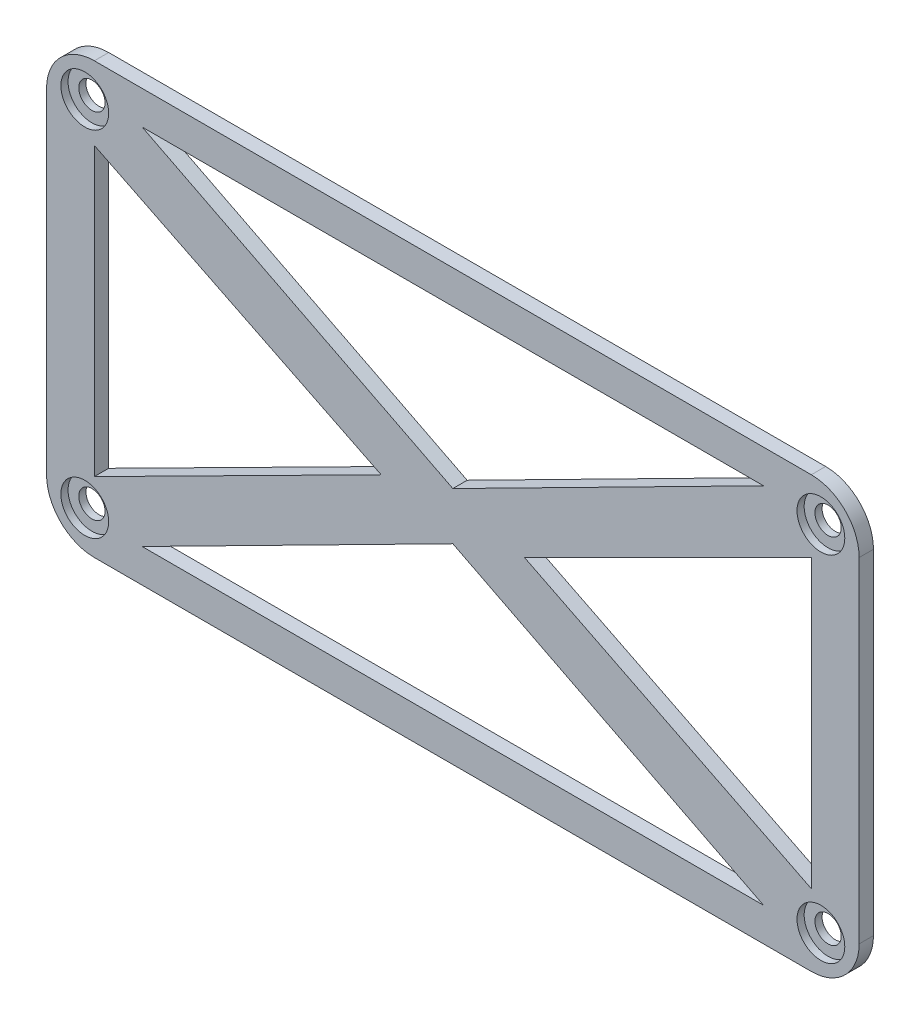
ISO-10303-21;
HEADER;
FILE_DESCRIPTION(('STEP AP214'),'2;1');
FILE_NAME('part.step','',(''),(''),'','','');
FILE_SCHEMA(('AUTOMOTIVE_DESIGN { 1 0 10303 214 1 1 1 1 }'));
ENDSEC;
DATA;
#1=APPLICATION_CONTEXT('core data for automotive mechanical design processes');
#2=APPLICATION_PROTOCOL_DEFINITION('international standard','automotive_design',2000,#1);
#3=PRODUCT_CONTEXT('',#1,'mechanical');
#4=PRODUCT('Part','Part','',(#3));
#5=PRODUCT_RELATED_PRODUCT_CATEGORY('part','',(#4));
#6=PRODUCT_DEFINITION_FORMATION('','',#4);
#7=PRODUCT_DEFINITION_CONTEXT('part definition',#1,'design');
#8=PRODUCT_DEFINITION('design','',#6,#7);
#9=PRODUCT_DEFINITION_SHAPE('','',#8);
#10=(LENGTH_UNIT() NAMED_UNIT(*) SI_UNIT(.MILLI.,.METRE.));
#11=(NAMED_UNIT(*) PLANE_ANGLE_UNIT() SI_UNIT($,.RADIAN.));
#12=(NAMED_UNIT(*) SI_UNIT($,.STERADIAN.) SOLID_ANGLE_UNIT());
#13=UNCERTAINTY_MEASURE_WITH_UNIT(LENGTH_MEASURE(1.E-05),#10,'distance_accuracy_value','');
#14=(GEOMETRIC_REPRESENTATION_CONTEXT(3) GLOBAL_UNCERTAINTY_ASSIGNED_CONTEXT((#13)) GLOBAL_UNIT_ASSIGNED_CONTEXT((#10,
#11,#12)) REPRESENTATION_CONTEXT('',''));
#15=CARTESIAN_POINT('',(0.,0.,0.));
#16=DIRECTION('',(0.,0.,1.));
#17=DIRECTION('',(1.,0.,0.));
#18=AXIS2_PLACEMENT_3D('',#15,#16,#17);
#19=CARTESIAN_POINT('',(-74.5741165309511,37.4873903075342,42.));
#20=DIRECTION('',(0.,0.,-1.));
#21=DIRECTION('',(-1.,0.,0.));
#22=AXIS2_PLACEMENT_3D('',#19,#20,#21);
#23=CYLINDRICAL_SURFACE('',#22,2.75000000000001);
#24=CARTESIAN_POINT('',(-74.5741165309511,37.4873903075342,0.));
#25=DIRECTION('',(0.,0.,1.));
#26=DIRECTION('',(1.,0.,0.));
#27=AXIS2_PLACEMENT_3D('',#24,#25,#26);
#28=CIRCLE('',#27,2.75000000000001);
#29=CARTESIAN_POINT('',(-71.8241165309511,37.4873903075342,0.));
#30=VERTEX_POINT('',#29);
#31=EDGE_CURVE('E306',#30,#30,#28,.F.);
#32=ORIENTED_EDGE('',*,*,#31,.T.);
#33=EDGE_LOOP('',(#32));
#34=FACE_BOUND('',#33,.T.);
#35=CARTESIAN_POINT('',(-74.5741165309511,37.4873903075342,1.5));
#36=DIRECTION('',(0.,0.,1.));
#37=DIRECTION('',(1.,0.,0.));
#38=AXIS2_PLACEMENT_3D('',#35,#36,#37);
#39=CIRCLE('',#38,2.75000000000001);
#40=CARTESIAN_POINT('',(-71.8241165309511,37.4873903075342,1.5));
#41=VERTEX_POINT('',#40);
#42=EDGE_CURVE('E43',#41,#41,#39,.T.);
#43=ORIENTED_EDGE('',*,*,#42,.T.);
#44=EDGE_LOOP('',(#43));
#45=FACE_BOUND('',#44,.T.);
#46=ADVANCED_FACE('F39',(#34,#45),#23,.F.);
#47=CARTESIAN_POINT('',(-74.5741165309511,-36.5126096924658,42.));
#48=DIRECTION('',(0.,0.,-1.));
#49=DIRECTION('',(-1.,0.,0.));
#50=AXIS2_PLACEMENT_3D('',#47,#48,#49);
#51=CYLINDRICAL_SURFACE('',#50,2.75000000000001);
#52=CARTESIAN_POINT('',(-74.5741165309511,-36.5126096924658,0.));
#53=DIRECTION('',(0.,0.,1.));
#54=DIRECTION('',(1.,0.,0.));
#55=AXIS2_PLACEMENT_3D('',#52,#53,#54);
#56=CIRCLE('',#55,2.75000000000001);
#57=CARTESIAN_POINT('',(-71.8241165309511,-36.5126096924658,0.));
#58=VERTEX_POINT('',#57);
#59=EDGE_CURVE('E233',#58,#58,#56,.F.);
#60=ORIENTED_EDGE('',*,*,#59,.T.);
#61=EDGE_LOOP('',(#60));
#62=FACE_BOUND('',#61,.T.);
#63=CARTESIAN_POINT('',(-74.5741165309511,-36.5126096924658,1.5));
#64=DIRECTION('',(0.,0.,1.));
#65=DIRECTION('',(1.,0.,0.));
#66=AXIS2_PLACEMENT_3D('',#63,#64,#65);
#67=CIRCLE('',#66,2.75000000000001);
#68=CARTESIAN_POINT('',(-71.8241165309511,-36.5126096924658,1.5));
#69=VERTEX_POINT('',#68);
#70=EDGE_CURVE('E259',#69,#69,#67,.T.);
#71=ORIENTED_EDGE('',*,*,#70,.T.);
#72=EDGE_LOOP('',(#71));
#73=FACE_BOUND('',#72,.T.);
#74=ADVANCED_FACE('F489',(#62,#73),#51,.F.);
#75=CARTESIAN_POINT('',(79.4258834690489,37.4873903075342,42.));
#76=DIRECTION('',(0.,0.,-1.));
#77=DIRECTION('',(-1.,0.,0.));
#78=AXIS2_PLACEMENT_3D('',#75,#76,#77);
#79=CYLINDRICAL_SURFACE('',#78,2.75000000000001);
#80=CARTESIAN_POINT('',(79.4258834690489,37.4873903075342,0.));
#81=DIRECTION('',(0.,0.,1.));
#82=DIRECTION('',(1.,0.,0.));
#83=AXIS2_PLACEMENT_3D('',#80,#81,#82);
#84=CIRCLE('',#83,2.75000000000001);
#85=CARTESIAN_POINT('',(82.1758834690489,37.4873903075342,0.));
#86=VERTEX_POINT('',#85);
#87=EDGE_CURVE('E237',#86,#86,#84,.F.);
#88=ORIENTED_EDGE('',*,*,#87,.T.);
#89=EDGE_LOOP('',(#88));
#90=FACE_BOUND('',#89,.T.);
#91=CARTESIAN_POINT('',(79.4258834690489,37.4873903075342,1.5));
#92=DIRECTION('',(0.,0.,1.));
#93=DIRECTION('',(1.,0.,0.));
#94=AXIS2_PLACEMENT_3D('',#91,#92,#93);
#95=CIRCLE('',#94,2.75000000000001);
#96=CARTESIAN_POINT('',(82.1758834690489,37.4873903075342,1.5));
#97=VERTEX_POINT('',#96);
#98=EDGE_CURVE('E255',#97,#97,#95,.T.);
#99=ORIENTED_EDGE('',*,*,#98,.T.);
#100=EDGE_LOOP('',(#99));
#101=FACE_BOUND('',#100,.T.);
#102=ADVANCED_FACE('F493',(#90,#101),#79,.F.);
#103=CARTESIAN_POINT('',(79.4258834690489,-36.5126096924658,42.));
#104=DIRECTION('',(0.,0.,-1.));
#105=DIRECTION('',(-1.,0.,0.));
#106=AXIS2_PLACEMENT_3D('',#103,#104,#105);
#107=CYLINDRICAL_SURFACE('',#106,2.75000000000001);
#108=CARTESIAN_POINT('',(79.4258834690489,-36.5126096924658,0.));
#109=DIRECTION('',(0.,0.,1.));
#110=DIRECTION('',(1.,0.,0.));
#111=AXIS2_PLACEMENT_3D('',#108,#109,#110);
#112=CIRCLE('',#111,2.75000000000001);
#113=CARTESIAN_POINT('',(82.1758834690489,-36.5126096924658,0.));
#114=VERTEX_POINT('',#113);
#115=EDGE_CURVE('E242',#114,#114,#112,.F.);
#116=ORIENTED_EDGE('',*,*,#115,.T.);
#117=EDGE_LOOP('',(#116));
#118=FACE_BOUND('',#117,.T.);
#119=CARTESIAN_POINT('',(79.4258834690489,-36.5126096924658,1.5));
#120=DIRECTION('',(0.,0.,1.));
#121=DIRECTION('',(1.,0.,0.));
#122=AXIS2_PLACEMENT_3D('',#119,#120,#121);
#123=CIRCLE('',#122,2.75000000000001);
#124=CARTESIAN_POINT('',(82.1758834690489,-36.5126096924658,1.5));
#125=VERTEX_POINT('',#124);
#126=EDGE_CURVE('E251',#125,#125,#123,.T.);
#127=ORIENTED_EDGE('',*,*,#126,.T.);
#128=EDGE_LOOP('',(#127));
#129=FACE_BOUND('',#128,.T.);
#130=ADVANCED_FACE('F498',(#118,#129),#107,.F.);
#131=CARTESIAN_POINT('',(-72.5741165309511,35.4873903075342,3.));
#132=DIRECTION('',(0.,0.,-1.));
#133=DIRECTION('',(-1.,0.,0.));
#134=AXIS2_PLACEMENT_3D('',#131,#132,#133);
#135=CYLINDRICAL_SURFACE('',#134,10.);
#136=CARTESIAN_POINT('',(-72.5741165309511,35.4873903075342,0.));
#137=DIRECTION('',(0.,0.,1.));
#138=DIRECTION('',(1.,0.,0.));
#139=AXIS2_PLACEMENT_3D('',#136,#137,#138);
#140=CIRCLE('',#139,10.);
#141=CARTESIAN_POINT('',(-72.5741165309511,45.4873903075342,0.));
#142=VERTEX_POINT('',#141);
#143=CARTESIAN_POINT('',(-82.5741165309511,35.4873903075342,0.));
#144=VERTEX_POINT('',#143);
#145=EDGE_CURVE('E350',#142,#144,#140,.T.);
#146=ORIENTED_EDGE('',*,*,#145,.T.);
#147=DIRECTION('',(0.,0.,-1.));
#148=VECTOR('',#147,1.);
#149=CARTESIAN_POINT('',(-82.5741165309511,35.4873903075342,3.));
#150=LINE('',#149,#148);
#151=CARTESIAN_POINT('',(-82.5741165309511,35.4873903075342,3.));
#152=VERTEX_POINT('',#151);
#153=EDGE_CURVE('E191',#152,#144,#150,.T.);
#154=ORIENTED_EDGE('',*,*,#153,.F.);
#155=CARTESIAN_POINT('',(-72.5741165309511,35.4873903075342,3.));
#156=DIRECTION('',(0.,0.,1.));
#157=DIRECTION('',(1.,0.,0.));
#158=AXIS2_PLACEMENT_3D('',#155,#156,#157);
#159=CIRCLE('',#158,10.);
#160=CARTESIAN_POINT('',(-72.5741165309511,45.4873903075342,3.));
#161=VERTEX_POINT('',#160);
#162=EDGE_CURVE('E351',#161,#152,#159,.T.);
#163=ORIENTED_EDGE('',*,*,#162,.F.);
#164=DIRECTION('',(0.,0.,-1.));
#165=VECTOR('',#164,1.);
#166=CARTESIAN_POINT('',(-72.5741165309511,45.4873903075342,3.));
#167=LINE('',#166,#165);
#168=EDGE_CURVE('E377',#161,#142,#167,.T.);
#169=ORIENTED_EDGE('',*,*,#168,.T.);
#170=EDGE_LOOP('',(#146,#154,#163,#169));
#171=FACE_BOUND('',#170,.T.);
#172=ADVANCED_FACE('F41',(#171),#135,.T.);
#173=CARTESIAN_POINT('',(-82.5741165309511,35.4873903075342,3.));
#174=DIRECTION('',(1.,0.,0.));
#175=DIRECTION('',(0.,0.,-1.));
#176=AXIS2_PLACEMENT_3D('',#173,#174,#175);
#177=PLANE('',#176);
#178=DIRECTION('',(0.,-1.,0.));
#179=VECTOR('',#178,1.);
#180=CARTESIAN_POINT('',(-82.5741165309511,35.4873903075342,0.));
#181=LINE('',#180,#179);
#182=CARTESIAN_POINT('',(-82.5741165309511,-34.5126096924658,0.));
#183=VERTEX_POINT('',#182);
#184=EDGE_CURVE('E381',#144,#183,#181,.T.);
#185=ORIENTED_EDGE('',*,*,#184,.T.);
#186=DIRECTION('',(0.,0.,-1.));
#187=VECTOR('',#186,1.);
#188=CARTESIAN_POINT('',(-82.5741165309511,-34.5126096924658,3.));
#189=LINE('',#188,#187);
#190=CARTESIAN_POINT('',(-82.5741165309511,-34.5126096924658,3.));
#191=VERTEX_POINT('',#190);
#192=EDGE_CURVE('E424',#191,#183,#189,.T.);
#193=ORIENTED_EDGE('',*,*,#192,.F.);
#194=DIRECTION('',(0.,-1.,0.));
#195=VECTOR('',#194,1.);
#196=CARTESIAN_POINT('',(-82.5741165309511,35.4873903075342,3.));
#197=LINE('',#196,#195);
#198=EDGE_CURVE('E355',#152,#191,#197,.T.);
#199=ORIENTED_EDGE('',*,*,#198,.F.);
#200=ORIENTED_EDGE('',*,*,#153,.T.);
#201=EDGE_LOOP('',(#185,#193,#199,#200));
#202=FACE_BOUND('',#201,.T.);
#203=ADVANCED_FACE('F476',(#202),#177,.F.);
#204=CARTESIAN_POINT('',(-72.5741165309511,-34.5126096924658,3.));
#205=DIRECTION('',(0.,0.,-1.));
#206=DIRECTION('',(-1.,0.,0.));
#207=AXIS2_PLACEMENT_3D('',#204,#205,#206);
#208=CYLINDRICAL_SURFACE('',#207,9.99999999999999);
#209=CARTESIAN_POINT('',(-72.5741165309511,-34.5126096924658,0.));
#210=DIRECTION('',(0.,0.,1.));
#211=DIRECTION('',(-1.,0.,0.));
#212=AXIS2_PLACEMENT_3D('',#209,#210,#211);
#213=CIRCLE('',#212,9.99999999999999);
#214=CARTESIAN_POINT('',(-72.574116530951,-44.5126096924658,0.));
#215=VERTEX_POINT('',#214);
#216=EDGE_CURVE('E384',#183,#215,#213,.T.);
#217=ORIENTED_EDGE('',*,*,#216,.T.);
#218=DIRECTION('',(0.,0.,-1.));
#219=VECTOR('',#218,1.);
#220=CARTESIAN_POINT('',(-72.574116530951,-44.5126096924658,3.));
#221=LINE('',#220,#219);
#222=CARTESIAN_POINT('',(-72.574116530951,-44.5126096924658,3.));
#223=VERTEX_POINT('',#222);
#224=EDGE_CURVE('E420',#223,#215,#221,.T.);
#225=ORIENTED_EDGE('',*,*,#224,.F.);
#226=CARTESIAN_POINT('',(-72.5741165309511,-34.5126096924658,3.));
#227=DIRECTION('',(0.,0.,1.));
#228=DIRECTION('',(-1.,0.,0.));
#229=AXIS2_PLACEMENT_3D('',#226,#227,#228);
#230=CIRCLE('',#229,9.99999999999999);
#231=EDGE_CURVE('E359',#191,#223,#230,.T.);
#232=ORIENTED_EDGE('',*,*,#231,.F.);
#233=ORIENTED_EDGE('',*,*,#192,.T.);
#234=EDGE_LOOP('',(#217,#225,#232,#233));
#235=FACE_BOUND('',#234,.T.);
#236=ADVANCED_FACE('F472',(#235),#208,.T.);
#237=CARTESIAN_POINT('',(-72.574116530951,-44.5126096924658,3.));
#238=DIRECTION('',(0.,1.,0.));
#239=DIRECTION('',(0.,0.,1.));
#240=AXIS2_PLACEMENT_3D('',#237,#238,#239);
#241=PLANE('',#240);
#242=DIRECTION('',(1.,0.,0.));
#243=VECTOR('',#242,1.);
#244=CARTESIAN_POINT('',(-72.574116530951,-44.5126096924658,0.));
#245=LINE('',#244,#243);
#246=CARTESIAN_POINT('',(77.425883469049,-44.5126096924658,0.));
#247=VERTEX_POINT('',#246);
#248=EDGE_CURVE('E387',#215,#247,#245,.T.);
#249=ORIENTED_EDGE('',*,*,#248,.T.);
#250=DIRECTION('',(0.,0.,-1.));
#251=VECTOR('',#250,1.);
#252=CARTESIAN_POINT('',(77.425883469049,-44.5126096924658,3.));
#253=LINE('',#252,#251);
#254=CARTESIAN_POINT('',(77.425883469049,-44.5126096924658,3.));
#255=VERTEX_POINT('',#254);
#256=EDGE_CURVE('E416',#255,#247,#253,.T.);
#257=ORIENTED_EDGE('',*,*,#256,.F.);
#258=DIRECTION('',(1.,0.,0.));
#259=VECTOR('',#258,1.);
#260=CARTESIAN_POINT('',(-72.574116530951,-44.5126096924658,3.));
#261=LINE('',#260,#259);
#262=EDGE_CURVE('E362',#223,#255,#261,.T.);
#263=ORIENTED_EDGE('',*,*,#262,.F.);
#264=ORIENTED_EDGE('',*,*,#224,.T.);
#265=EDGE_LOOP('',(#249,#257,#263,#264));
#266=FACE_BOUND('',#265,.T.);
#267=ADVANCED_FACE('F469',(#266),#241,.F.);
#268=CARTESIAN_POINT('',(77.425883469049,-34.5126096924658,3.));
#269=DIRECTION('',(0.,0.,-1.));
#270=DIRECTION('',(-1.,0.,0.));
#271=AXIS2_PLACEMENT_3D('',#268,#269,#270);
#272=CYLINDRICAL_SURFACE('',#271,9.99999999999999);
#273=CARTESIAN_POINT('',(77.425883469049,-34.5126096924658,0.));
#274=DIRECTION('',(0.,0.,1.));
#275=DIRECTION('',(-1.,0.,0.));
#276=AXIS2_PLACEMENT_3D('',#273,#274,#275);
#277=CIRCLE('',#276,9.99999999999999);
#278=CARTESIAN_POINT('',(87.425883469049,-34.5126096924658,0.));
#279=VERTEX_POINT('',#278);
#280=EDGE_CURVE('E390',#247,#279,#277,.T.);
#281=ORIENTED_EDGE('',*,*,#280,.T.);
#282=DIRECTION('',(0.,0.,-1.));
#283=VECTOR('',#282,1.);
#284=CARTESIAN_POINT('',(87.425883469049,-34.5126096924658,3.));
#285=LINE('',#284,#283);
#286=CARTESIAN_POINT('',(87.425883469049,-34.5126096924658,3.));
#287=VERTEX_POINT('',#286);
#288=EDGE_CURVE('E412',#287,#279,#285,.T.);
#289=ORIENTED_EDGE('',*,*,#288,.F.);
#290=CARTESIAN_POINT('',(77.425883469049,-34.5126096924658,3.));
#291=DIRECTION('',(0.,0.,1.));
#292=DIRECTION('',(-1.,0.,0.));
#293=AXIS2_PLACEMENT_3D('',#290,#291,#292);
#294=CIRCLE('',#293,9.99999999999999);
#295=EDGE_CURVE('E365',#255,#287,#294,.T.);
#296=ORIENTED_EDGE('',*,*,#295,.F.);
#297=ORIENTED_EDGE('',*,*,#256,.T.);
#298=EDGE_LOOP('',(#281,#289,#296,#297));
#299=FACE_BOUND('',#298,.T.);
#300=ADVANCED_FACE('F465',(#299),#272,.T.);
#301=CARTESIAN_POINT('',(87.425883469049,35.4873903075342,3.));
#302=DIRECTION('',(-1.,0.,0.));
#303=DIRECTION('',(0.,0.,1.));
#304=AXIS2_PLACEMENT_3D('',#301,#302,#303);
#305=PLANE('',#304);
#306=DIRECTION('',(0.,1.,0.));
#307=VECTOR('',#306,1.);
#308=CARTESIAN_POINT('',(87.425883469049,35.4873903075342,0.));
#309=LINE('',#308,#307);
#310=CARTESIAN_POINT('',(87.425883469049,35.4873903075342,0.));
#311=VERTEX_POINT('',#310);
#312=EDGE_CURVE('E393',#279,#311,#309,.T.);
#313=ORIENTED_EDGE('',*,*,#312,.T.);
#314=DIRECTION('',(0.,0.,-1.));
#315=VECTOR('',#314,1.);
#316=CARTESIAN_POINT('',(87.425883469049,35.4873903075342,3.));
#317=LINE('',#316,#315);
#318=CARTESIAN_POINT('',(87.425883469049,35.4873903075342,3.));
#319=VERTEX_POINT('',#318);
#320=EDGE_CURVE('E408',#319,#311,#317,.T.);
#321=ORIENTED_EDGE('',*,*,#320,.F.);
#322=DIRECTION('',(0.,1.,0.));
#323=VECTOR('',#322,1.);
#324=CARTESIAN_POINT('',(87.425883469049,35.4873903075342,3.));
#325=LINE('',#324,#323);
#326=EDGE_CURVE('E368',#287,#319,#325,.T.);
#327=ORIENTED_EDGE('',*,*,#326,.F.);
#328=ORIENTED_EDGE('',*,*,#288,.T.);
#329=EDGE_LOOP('',(#313,#321,#327,#328));
#330=FACE_BOUND('',#329,.T.);
#331=ADVANCED_FACE('F460',(#330),#305,.F.);
#332=CARTESIAN_POINT('',(77.425883469049,35.4873903075342,3.));
#333=DIRECTION('',(0.,0.,-1.));
#334=DIRECTION('',(-1.,0.,0.));
#335=AXIS2_PLACEMENT_3D('',#332,#333,#334);
#336=CYLINDRICAL_SURFACE('',#335,10.);
#337=CARTESIAN_POINT('',(77.425883469049,35.4873903075342,0.));
#338=DIRECTION('',(0.,0.,1.));
#339=DIRECTION('',(1.,0.,0.));
#340=AXIS2_PLACEMENT_3D('',#337,#338,#339);
#341=CIRCLE('',#340,10.);
#342=CARTESIAN_POINT('',(77.425883469049,45.4873903075342,0.));
#343=VERTEX_POINT('',#342);
#344=EDGE_CURVE('E396',#311,#343,#341,.T.);
#345=ORIENTED_EDGE('',*,*,#344,.T.);
#346=DIRECTION('',(0.,0.,-1.));
#347=VECTOR('',#346,1.);
#348=CARTESIAN_POINT('',(77.425883469049,45.4873903075342,3.));
#349=LINE('',#348,#347);
#350=CARTESIAN_POINT('',(77.425883469049,45.4873903075342,3.));
#351=VERTEX_POINT('',#350);
#352=EDGE_CURVE('E404',#351,#343,#349,.T.);
#353=ORIENTED_EDGE('',*,*,#352,.F.);
#354=CARTESIAN_POINT('',(77.425883469049,35.4873903075342,3.));
#355=DIRECTION('',(0.,0.,1.));
#356=DIRECTION('',(1.,0.,0.));
#357=AXIS2_PLACEMENT_3D('',#354,#355,#356);
#358=CIRCLE('',#357,10.);
#359=EDGE_CURVE('E371',#319,#351,#358,.T.);
#360=ORIENTED_EDGE('',*,*,#359,.F.);
#361=ORIENTED_EDGE('',*,*,#320,.T.);
#362=EDGE_LOOP('',(#345,#353,#360,#361));
#363=FACE_BOUND('',#362,.T.);
#364=ADVANCED_FACE('F454',(#363),#336,.T.);
#365=CARTESIAN_POINT('',(-72.5741165309511,45.4873903075342,3.));
#366=DIRECTION('',(0.,-1.,0.));
#367=DIRECTION('',(1.,0.,0.));
#368=AXIS2_PLACEMENT_3D('',#365,#366,#367);
#369=PLANE('',#368);
#370=DIRECTION('',(-1.,0.,0.));
#371=VECTOR('',#370,1.);
#372=CARTESIAN_POINT('',(-72.5741165309511,45.4873903075342,0.));
#373=LINE('',#372,#371);
#374=EDGE_CURVE('E356',#343,#142,#373,.T.);
#375=ORIENTED_EDGE('',*,*,#374,.T.);
#376=ORIENTED_EDGE('',*,*,#168,.F.);
#377=DIRECTION('',(-1.,0.,0.));
#378=VECTOR('',#377,1.);
#379=CARTESIAN_POINT('',(-72.5741165309511,45.4873903075342,3.));
#380=LINE('',#379,#378);
#381=EDGE_CURVE('E374',#351,#161,#380,.T.);
#382=ORIENTED_EDGE('',*,*,#381,.F.);
#383=ORIENTED_EDGE('',*,*,#352,.T.);
#384=EDGE_LOOP('',(#375,#376,#382,#383));
#385=FACE_BOUND('',#384,.T.);
#386=ADVANCED_FACE('F450',(#385),#369,.F.);
#387=CARTESIAN_POINT('',(-72.5741165309511,35.4873903075342,3.));
#388=DIRECTION('',(0.,0.,1.));
#389=DIRECTION('',(1.,0.,0.));
#390=AXIS2_PLACEMENT_3D('',#387,#388,#389);
#391=PLANE('',#390);
#392=CARTESIAN_POINT('',(-74.5741165309511,-36.5126096924658,3.));
#393=DIRECTION('',(0.,0.,1.));
#394=DIRECTION('',(1.,0.,0.));
#395=AXIS2_PLACEMENT_3D('',#392,#393,#394);
#396=CIRCLE('',#395,5.00000000000001);
#397=CARTESIAN_POINT('',(-69.5741165309511,-36.5126096924658,3.));
#398=VERTEX_POINT('',#397);
#399=EDGE_CURVE('E604',#398,#398,#396,.T.);
#400=ORIENTED_EDGE('',*,*,#399,.F.);
#401=EDGE_LOOP('',(#400));
#402=FACE_BOUND('',#401,.T.);
#403=CARTESIAN_POINT('',(79.4258834690489,-36.5126096924658,3.));
#404=DIRECTION('',(0.,0.,1.));
#405=DIRECTION('',(1.,0.,0.));
#406=AXIS2_PLACEMENT_3D('',#403,#404,#405);
#407=CIRCLE('',#406,5.00000000000001);
#408=CARTESIAN_POINT('',(84.4258834690489,-36.5126096924658,3.));
#409=VERTEX_POINT('',#408);
#410=EDGE_CURVE('E596',#409,#409,#407,.T.);
#411=ORIENTED_EDGE('',*,*,#410,.F.);
#412=EDGE_LOOP('',(#411));
#413=FACE_BOUND('',#412,.T.);
#414=CARTESIAN_POINT('',(79.4258834690489,37.4873903075342,3.));
#415=DIRECTION('',(0.,0.,1.));
#416=DIRECTION('',(1.,0.,0.));
#417=AXIS2_PLACEMENT_3D('',#414,#415,#416);
#418=CIRCLE('',#417,5.00000000000001);
#419=CARTESIAN_POINT('',(84.4258834690489,37.4873903075342,3.));
#420=VERTEX_POINT('',#419);
#421=EDGE_CURVE('E584',#420,#420,#418,.T.);
#422=ORIENTED_EDGE('',*,*,#421,.F.);
#423=EDGE_LOOP('',(#422));
#424=FACE_BOUND('',#423,.T.);
#425=CARTESIAN_POINT('',(-74.5741165309511,37.4873903075342,3.));
#426=DIRECTION('',(0.,0.,1.));
#427=DIRECTION('',(1.,0.,0.));
#428=AXIS2_PLACEMENT_3D('',#425,#426,#427);
#429=CIRCLE('',#428,5.00000000000001);
#430=CARTESIAN_POINT('',(-69.5741165309511,37.4873903075342,3.));
#431=VERTEX_POINT('',#430);
#432=EDGE_CURVE('E276',#431,#431,#429,.T.);
#433=ORIENTED_EDGE('',*,*,#432,.F.);
#434=EDGE_LOOP('',(#433));
#435=FACE_BOUND('',#434,.T.);
#436=DIRECTION('',(0.891666769258181,0.452692359777231,0.));
#437=VECTOR('',#436,1.);
#438=CARTESIAN_POINT('',(-41.0583092294832,-26.5891998317206,3.));
#439=LINE('',#438,#437);
#440=CARTESIAN_POINT('',(-62.5741165309511,-37.5126096924658,3.));
#441=VERTEX_POINT('',#440);
#442=CARTESIAN_POINT('',(2.42588346904892,-4.51260969246582,3.));
#443=VERTEX_POINT('',#442);
#444=EDGE_CURVE('E342',#441,#443,#439,.T.);
#445=ORIENTED_EDGE('',*,*,#444,.T.);
#446=DIRECTION('',(0.891666769258181,-0.45269235977723,0.));
#447=VECTOR('',#446,1.);
#448=CARTESIAN_POINT('',(-73.3503679423173,33.9584102548432,3.));
#449=LINE('',#448,#447);
#450=CARTESIAN_POINT('',(67.4258834690489,-37.5126096924658,3.));
#451=VERTEX_POINT('',#450);
#452=EDGE_CURVE('E346',#443,#451,#449,.T.);
#453=ORIENTED_EDGE('',*,*,#452,.T.);
#454=DIRECTION('',(-1.,0.,0.));
#455=VECTOR('',#454,1.);
#456=CARTESIAN_POINT('',(-72.5741165309511,-37.5126096924658,3.));
#457=LINE('',#456,#455);
#458=EDGE_CURVE('E246',#451,#441,#457,.T.);
#459=ORIENTED_EDGE('',*,*,#458,.T.);
#460=EDGE_LOOP('',(#445,#453,#459));
#461=FACE_BOUND('',#460,.T.);
#462=DIRECTION('',(0.,-1.,0.));
#463=VECTOR('',#462,1.);
#464=CARTESIAN_POINT('',(77.4258834690489,35.4873903075342,3.));
#465=LINE('',#464,#463);
#466=CARTESIAN_POINT('',(77.4258834690489,30.4873903075342,3.));
#467=VERTEX_POINT('',#466);
#468=CARTESIAN_POINT('',(77.425883469049,-29.5126096924658,3.));
#469=VERTEX_POINT('',#468);
#470=EDGE_CURVE('E332',#467,#469,#465,.T.);
#471=ORIENTED_EDGE('',*,*,#470,.T.);
#472=DIRECTION('',(-0.894427190999916,0.447213595499958,0.));
#473=VECTOR('',#472,1.);
#474=CARTESIAN_POINT('',(-68.5741165309511,43.4873903075342,3.));
#475=LINE('',#474,#473);
#476=CARTESIAN_POINT('',(17.4258834690489,0.487390307534183,3.));
#477=VERTEX_POINT('',#476);
#478=EDGE_CURVE('E238',#469,#477,#475,.T.);
#479=ORIENTED_EDGE('',*,*,#478,.T.);
#480=DIRECTION('',(0.894427190999916,0.447213595499958,0.));
#481=VECTOR('',#480,1.);
#482=CARTESIAN_POINT('',(-40.5741165309511,-28.5126096924658,3.));
#483=LINE('',#482,#481);
#484=EDGE_CURVE('E328',#477,#467,#483,.T.);
#485=ORIENTED_EDGE('',*,*,#484,.T.);
#486=EDGE_LOOP('',(#471,#479,#485));
#487=FACE_BOUND('',#486,.T.);
#488=DIRECTION('',(-0.892447356199141,-0.451151544841824,0.));
#489=VECTOR('',#488,1.);
#490=CARTESIAN_POINT('',(-46.2698384257877,-16.5465298243597,3.));
#491=LINE('',#490,#489);
#492=CARTESIAN_POINT('',(-12.5741165309511,0.487390307534183,3.));
#493=VERTEX_POINT('',#492);
#494=CARTESIAN_POINT('',(-72.5741165309511,-29.843914393501,3.));
#495=VERTEX_POINT('',#494);
#496=EDGE_CURVE('E320',#493,#495,#491,.T.);
#497=ORIENTED_EDGE('',*,*,#496,.T.);
#498=DIRECTION('',(0.,1.,0.));
#499=VECTOR('',#498,1.);
#500=CARTESIAN_POINT('',(-72.5741165309511,35.4873903075342,3.));
#501=LINE('',#500,#499);
#502=CARTESIAN_POINT('',(-72.5741165309511,30.156085606499,3.));
#503=VERTEX_POINT('',#502);
#504=EDGE_CURVE('E324',#495,#503,#501,.T.);
#505=ORIENTED_EDGE('',*,*,#504,.T.);
#506=DIRECTION('',(0.896398298935638,-0.443249466627196,0.));
#507=VECTOR('',#506,1.);
#508=CARTESIAN_POINT('',(-74.6923935271396,31.2035275191444,3.));
#509=LINE('',#508,#507);
#510=EDGE_CURVE('E316',#503,#493,#509,.T.);
#511=ORIENTED_EDGE('',*,*,#510,.T.);
#512=EDGE_LOOP('',(#497,#505,#511));
#513=FACE_BOUND('',#512,.T.);
#514=DIRECTION('',(-0.891666769258181,0.45269235977723,0.));
#515=VECTOR('',#514,1.);
#516=CARTESIAN_POINT('',(-69.313860603213,41.9091065288364,3.));
#517=LINE('',#516,#515);
#518=CARTESIAN_POINT('',(2.42588346904894,5.48739030753417,3.));
#519=VERTEX_POINT('',#518);
#520=CARTESIAN_POINT('',(-62.5741165309511,38.4873903075342,3.));
#521=VERTEX_POINT('',#520);
#522=EDGE_CURVE('E198',#519,#521,#517,.T.);
#523=ORIENTED_EDGE('',*,*,#522,.T.);
#524=DIRECTION('',(1.,0.,0.));
#525=VECTOR('',#524,1.);
#526=CARTESIAN_POINT('',(-72.5741165309511,38.4873903075342,3.));
#527=LINE('',#526,#525);
#528=CARTESIAN_POINT('',(67.4258834690489,38.4873903075342,3.));
#529=VERTEX_POINT('',#528);
#530=EDGE_CURVE('E312',#521,#529,#527,.T.);
#531=ORIENTED_EDGE('',*,*,#530,.T.);
#532=DIRECTION('',(-0.891666769258181,-0.45269235977723,0.));
#533=VECTOR('',#532,1.);
#534=CARTESIAN_POINT('',(-45.0948165685875,-18.6385035577274,3.));
#535=LINE('',#534,#533);
#536=EDGE_CURVE('E307',#529,#519,#535,.T.);
#537=ORIENTED_EDGE('',*,*,#536,.T.);
#538=EDGE_LOOP('',(#523,#531,#537));
#539=FACE_BOUND('',#538,.T.);
#540=ORIENTED_EDGE('',*,*,#162,.T.);
#541=ORIENTED_EDGE('',*,*,#198,.T.);
#542=ORIENTED_EDGE('',*,*,#231,.T.);
#543=ORIENTED_EDGE('',*,*,#262,.T.);
#544=ORIENTED_EDGE('',*,*,#295,.T.);
#545=ORIENTED_EDGE('',*,*,#326,.T.);
#546=ORIENTED_EDGE('',*,*,#359,.T.);
#547=ORIENTED_EDGE('',*,*,#381,.T.);
#548=EDGE_LOOP('',(#540,#541,#542,#543,#544,#545,#546,#547));
#549=FACE_BOUND('',#548,.T.);
#550=ADVANCED_FACE('F437',(#402,#413,#424,#435,#461,#487,#513,#539,#549),#391,.T.);
#551=CARTESIAN_POINT('',(-72.5741165309511,35.4873903075342,0.));
#552=DIRECTION('',(0.,0.,1.));
#553=DIRECTION('',(1.,0.,0.));
#554=AXIS2_PLACEMENT_3D('',#551,#552,#553);
#555=PLANE('',#554);
#556=DIRECTION('',(0.891666769258181,-0.45269235977723,0.));
#557=VECTOR('',#556,1.);
#558=CARTESIAN_POINT('',(-73.3503679423173,33.9584102548432,0.));
#559=LINE('',#558,#557);
#560=CARTESIAN_POINT('',(2.42588346904892,-4.51260969246582,0.));
#561=VERTEX_POINT('',#560);
#562=CARTESIAN_POINT('',(67.4258834690489,-37.5126096924658,0.));
#563=VERTEX_POINT('',#562);
#564=EDGE_CURVE('E11',#561,#563,#559,.T.);
#565=ORIENTED_EDGE('',*,*,#564,.F.);
#566=DIRECTION('',(0.891666769258181,0.452692359777231,0.));
#567=VECTOR('',#566,1.);
#568=CARTESIAN_POINT('',(-41.0583092294832,-26.5891998317206,0.));
#569=LINE('',#568,#567);
#570=CARTESIAN_POINT('',(-62.5741165309511,-37.5126096924658,0.));
#571=VERTEX_POINT('',#570);
#572=EDGE_CURVE('E49',#571,#561,#569,.T.);
#573=ORIENTED_EDGE('',*,*,#572,.F.);
#574=DIRECTION('',(-1.,0.,0.));
#575=VECTOR('',#574,1.);
#576=CARTESIAN_POINT('',(-72.5741165309511,-37.5126096924658,0.));
#577=LINE('',#576,#575);
#578=EDGE_CURVE('E232',#563,#571,#577,.T.);
#579=ORIENTED_EDGE('',*,*,#578,.F.);
#580=EDGE_LOOP('',(#565,#573,#579));
#581=FACE_BOUND('',#580,.T.);
#582=ORIENTED_EDGE('',*,*,#115,.F.);
#583=EDGE_LOOP('',(#582));
#584=FACE_BOUND('',#583,.T.);
#585=ORIENTED_EDGE('',*,*,#87,.F.);
#586=EDGE_LOOP('',(#585));
#587=FACE_BOUND('',#586,.T.);
#588=ORIENTED_EDGE('',*,*,#59,.F.);
#589=EDGE_LOOP('',(#588));
#590=FACE_BOUND('',#589,.T.);
#591=DIRECTION('',(-0.894427190999916,0.447213595499958,0.));
#592=VECTOR('',#591,1.);
#593=CARTESIAN_POINT('',(-68.5741165309511,43.4873903075342,0.));
#594=LINE('',#593,#592);
#595=CARTESIAN_POINT('',(77.425883469049,-29.5126096924658,0.));
#596=VERTEX_POINT('',#595);
#597=CARTESIAN_POINT('',(17.4258834690489,0.487390307534172,0.));
#598=VERTEX_POINT('',#597);
#599=EDGE_CURVE('E228',#596,#598,#594,.T.);
#600=ORIENTED_EDGE('',*,*,#599,.F.);
#601=DIRECTION('',(0.,-1.,0.));
#602=VECTOR('',#601,1.);
#603=CARTESIAN_POINT('',(77.4258834690489,35.4873903075342,0.));
#604=LINE('',#603,#602);
#605=CARTESIAN_POINT('',(77.425883469049,30.4873903075342,0.));
#606=VERTEX_POINT('',#605);
#607=EDGE_CURVE('E225',#606,#596,#604,.T.);
#608=ORIENTED_EDGE('',*,*,#607,.F.);
#609=DIRECTION('',(0.894427190999916,0.447213595499958,0.));
#610=VECTOR('',#609,1.);
#611=CARTESIAN_POINT('',(-40.5741165309511,-28.5126096924658,0.));
#612=LINE('',#611,#610);
#613=EDGE_CURVE('E222',#598,#606,#612,.T.);
#614=ORIENTED_EDGE('',*,*,#613,.F.);
#615=EDGE_LOOP('',(#600,#608,#614));
#616=FACE_BOUND('',#615,.T.);
#617=DIRECTION('',(0.,1.,0.));
#618=VECTOR('',#617,1.);
#619=CARTESIAN_POINT('',(-72.5741165309511,35.4873903075342,0.));
#620=LINE('',#619,#618);
#621=CARTESIAN_POINT('',(-72.5741165309511,-29.843914393501,0.));
#622=VERTEX_POINT('',#621);
#623=CARTESIAN_POINT('',(-72.5741165309511,30.156085606499,0.));
#624=VERTEX_POINT('',#623);
#625=EDGE_CURVE('E218',#622,#624,#620,.T.);
#626=ORIENTED_EDGE('',*,*,#625,.F.);
#627=DIRECTION('',(-0.892447356199141,-0.451151544841824,0.));
#628=VECTOR('',#627,1.);
#629=CARTESIAN_POINT('',(-46.2698384257877,-16.5465298243597,0.));
#630=LINE('',#629,#628);
#631=CARTESIAN_POINT('',(-12.5741165309511,0.487390307534183,0.));
#632=VERTEX_POINT('',#631);
#633=EDGE_CURVE('E215',#632,#622,#630,.T.);
#634=ORIENTED_EDGE('',*,*,#633,.F.);
#635=DIRECTION('',(0.896398298935638,-0.443249466627196,0.));
#636=VECTOR('',#635,1.);
#637=CARTESIAN_POINT('',(-74.6923935271396,31.2035275191444,0.));
#638=LINE('',#637,#636);
#639=EDGE_CURVE('E209',#624,#632,#638,.T.);
#640=ORIENTED_EDGE('',*,*,#639,.F.);
#641=EDGE_LOOP('',(#626,#634,#640));
#642=FACE_BOUND('',#641,.T.);
#643=DIRECTION('',(1.,0.,0.));
#644=VECTOR('',#643,1.);
#645=CARTESIAN_POINT('',(-72.5741165309511,38.4873903075342,0.));
#646=LINE('',#645,#644);
#647=CARTESIAN_POINT('',(-62.5741165309511,38.4873903075342,0.));
#648=VERTEX_POINT('',#647);
#649=CARTESIAN_POINT('',(67.425883469049,38.4873903075342,0.));
#650=VERTEX_POINT('',#649);
#651=EDGE_CURVE('E205',#648,#650,#646,.T.);
#652=ORIENTED_EDGE('',*,*,#651,.F.);
#653=DIRECTION('',(-0.891666769258181,0.45269235977723,0.));
#654=VECTOR('',#653,1.);
#655=CARTESIAN_POINT('',(-69.313860603213,41.9091065288364,0.));
#656=LINE('',#655,#654);
#657=CARTESIAN_POINT('',(2.42588346904894,5.48739030753417,0.));
#658=VERTEX_POINT('',#657);
#659=EDGE_CURVE('E190',#658,#648,#656,.T.);
#660=ORIENTED_EDGE('',*,*,#659,.F.);
#661=DIRECTION('',(-0.891666769258181,-0.45269235977723,0.));
#662=VECTOR('',#661,1.);
#663=CARTESIAN_POINT('',(-45.0948165685875,-18.6385035577274,0.));
#664=LINE('',#663,#662);
#665=EDGE_CURVE('E178',#650,#658,#664,.T.);
#666=ORIENTED_EDGE('',*,*,#665,.F.);
#667=EDGE_LOOP('',(#652,#660,#666));
#668=FACE_BOUND('',#667,.T.);
#669=ORIENTED_EDGE('',*,*,#31,.F.);
#670=EDGE_LOOP('',(#669));
#671=FACE_BOUND('',#670,.T.);
#672=ORIENTED_EDGE('',*,*,#145,.F.);
#673=ORIENTED_EDGE('',*,*,#374,.F.);
#674=ORIENTED_EDGE('',*,*,#344,.F.);
#675=ORIENTED_EDGE('',*,*,#312,.F.);
#676=ORIENTED_EDGE('',*,*,#280,.F.);
#677=ORIENTED_EDGE('',*,*,#248,.F.);
#678=ORIENTED_EDGE('',*,*,#216,.F.);
#679=ORIENTED_EDGE('',*,*,#184,.F.);
#680=EDGE_LOOP('',(#672,#673,#674,#675,#676,#677,#678,#679));
#681=FACE_BOUND('',#680,.T.);
#682=ADVANCED_FACE('F203',(#581,#584,#587,#590,#616,#642,#668,#671,#681),#555,.F.);
#683=CARTESIAN_POINT('',(-62.5741165309511,38.4873903075342,42.));
#684=DIRECTION('',(0.,-1.,0.));
#685=DIRECTION('',(0.,0.,-1.));
#686=AXIS2_PLACEMENT_3D('',#683,#684,#685);
#687=PLANE('',#686);
#688=DIRECTION('',(0.,0.,-1.));
#689=VECTOR('',#688,1.);
#690=CARTESIAN_POINT('',(-62.5741165309511,38.4873903075342,42.));
#691=LINE('',#690,#689);
#692=EDGE_CURVE('E201',#521,#648,#691,.T.);
#693=ORIENTED_EDGE('',*,*,#692,.T.);
#694=ORIENTED_EDGE('',*,*,#651,.T.);
#695=DIRECTION('',(0.,0.,-1.));
#696=VECTOR('',#695,1.);
#697=CARTESIAN_POINT('',(67.4258834690489,38.4873903075342,42.));
#698=LINE('',#697,#696);
#699=EDGE_CURVE('E184',#529,#650,#698,.T.);
#700=ORIENTED_EDGE('',*,*,#699,.F.);
#701=ORIENTED_EDGE('',*,*,#530,.F.);
#702=EDGE_LOOP('',(#693,#694,#700,#701));
#703=FACE_BOUND('',#702,.T.);
#704=ADVANCED_FACE('F436',(#703),#687,.T.);
#705=CARTESIAN_POINT('',(-62.5741165309511,38.4873903075342,42.));
#706=DIRECTION('',(0.45269235977723,0.891666769258181,0.));
#707=DIRECTION('',(-0.891666769258181,0.45269235977723,0.));
#708=AXIS2_PLACEMENT_3D('',#705,#706,#707);
#709=PLANE('',#708);
#710=DIRECTION('',(0.,0.,-1.));
#711=VECTOR('',#710,1.);
#712=CARTESIAN_POINT('',(2.42588346904894,5.48739030753417,42.));
#713=LINE('',#712,#711);
#714=EDGE_CURVE('E181',#519,#658,#713,.T.);
#715=ORIENTED_EDGE('',*,*,#714,.T.);
#716=ORIENTED_EDGE('',*,*,#659,.T.);
#717=ORIENTED_EDGE('',*,*,#692,.F.);
#718=ORIENTED_EDGE('',*,*,#522,.F.);
#719=EDGE_LOOP('',(#715,#716,#717,#718));
#720=FACE_BOUND('',#719,.T.);
#721=ADVANCED_FACE('F194',(#720),#709,.T.);
#722=CARTESIAN_POINT('',(67.4258834690489,38.4873903075342,42.));
#723=DIRECTION('',(-0.45269235977723,0.891666769258181,0.));
#724=DIRECTION('',(-0.891666769258181,-0.45269235977723,0.));
#725=AXIS2_PLACEMENT_3D('',#722,#723,#724);
#726=PLANE('',#725);
#727=ORIENTED_EDGE('',*,*,#699,.T.);
#728=ORIENTED_EDGE('',*,*,#665,.T.);
#729=ORIENTED_EDGE('',*,*,#714,.F.);
#730=ORIENTED_EDGE('',*,*,#536,.F.);
#731=EDGE_LOOP('',(#727,#728,#729,#730));
#732=FACE_BOUND('',#731,.T.);
#733=ADVANCED_FACE('F180',(#732),#726,.T.);
#734=CARTESIAN_POINT('',(-72.5741165309511,30.156085606499,42.));
#735=DIRECTION('',(1.,0.,0.));
#736=DIRECTION('',(0.,1.,0.));
#737=AXIS2_PLACEMENT_3D('',#734,#735,#736);
#738=PLANE('',#737);
#739=DIRECTION('',(0.,0.,-1.));
#740=VECTOR('',#739,1.);
#741=CARTESIAN_POINT('',(-72.5741165309511,-29.843914393501,42.));
#742=LINE('',#741,#740);
#743=EDGE_CURVE('E293',#495,#622,#742,.T.);
#744=ORIENTED_EDGE('',*,*,#743,.T.);
#745=ORIENTED_EDGE('',*,*,#625,.T.);
#746=DIRECTION('',(0.,0.,-1.));
#747=VECTOR('',#746,1.);
#748=CARTESIAN_POINT('',(-72.5741165309511,30.156085606499,42.));
#749=LINE('',#748,#747);
#750=EDGE_CURVE('E286',#503,#624,#749,.T.);
#751=ORIENTED_EDGE('',*,*,#750,.F.);
#752=ORIENTED_EDGE('',*,*,#504,.F.);
#753=EDGE_LOOP('',(#744,#745,#751,#752));
#754=FACE_BOUND('',#753,.T.);
#755=ADVANCED_FACE('F517',(#754),#738,.T.);
#756=CARTESIAN_POINT('',(-72.5741165309511,-29.843914393501,42.));
#757=DIRECTION('',(-0.451151544841824,0.892447356199141,0.));
#758=DIRECTION('',(-0.892447356199141,-0.451151544841824,0.));
#759=AXIS2_PLACEMENT_3D('',#756,#757,#758);
#760=PLANE('',#759);
#761=DIRECTION('',(0.,0.,-1.));
#762=VECTOR('',#761,1.);
#763=CARTESIAN_POINT('',(-12.5741165309511,0.487390307534183,42.));
#764=LINE('',#763,#762);
#765=EDGE_CURVE('E289',#493,#632,#764,.T.);
#766=ORIENTED_EDGE('',*,*,#765,.T.);
#767=ORIENTED_EDGE('',*,*,#633,.T.);
#768=ORIENTED_EDGE('',*,*,#743,.F.);
#769=ORIENTED_EDGE('',*,*,#496,.F.);
#770=EDGE_LOOP('',(#766,#767,#768,#769));
#771=FACE_BOUND('',#770,.T.);
#772=ADVANCED_FACE('F520',(#771),#760,.T.);
#773=CARTESIAN_POINT('',(-72.5741165309511,30.156085606499,42.));
#774=DIRECTION('',(-0.443249466627196,-0.896398298935638,0.));
#775=DIRECTION('',(0.896398298935638,-0.443249466627196,0.));
#776=AXIS2_PLACEMENT_3D('',#773,#774,#775);
#777=PLANE('',#776);
#778=ORIENTED_EDGE('',*,*,#750,.T.);
#779=ORIENTED_EDGE('',*,*,#639,.T.);
#780=ORIENTED_EDGE('',*,*,#765,.F.);
#781=ORIENTED_EDGE('',*,*,#510,.F.);
#782=EDGE_LOOP('',(#778,#779,#780,#781));
#783=FACE_BOUND('',#782,.T.);
#784=ADVANCED_FACE('F524',(#783),#777,.T.);
#785=CARTESIAN_POINT('',(17.4258834690489,0.487390307534183,42.));
#786=DIRECTION('',(0.447213595499958,0.894427190999916,0.));
#787=DIRECTION('',(-0.894427190999916,0.447213595499958,0.));
#788=AXIS2_PLACEMENT_3D('',#785,#786,#787);
#789=PLANE('',#788);
#790=DIRECTION('',(0.,0.,-1.));
#791=VECTOR('',#790,1.);
#792=CARTESIAN_POINT('',(77.425883469049,-29.5126096924658,42.));
#793=LINE('',#792,#791);
#794=EDGE_CURVE('E273',#469,#596,#793,.T.);
#795=ORIENTED_EDGE('',*,*,#794,.T.);
#796=ORIENTED_EDGE('',*,*,#599,.T.);
#797=DIRECTION('',(0.,0.,-1.));
#798=VECTOR('',#797,1.);
#799=CARTESIAN_POINT('',(17.4258834690489,0.487390307534183,42.));
#800=LINE('',#799,#798);
#801=EDGE_CURVE('E266',#477,#598,#800,.T.);
#802=ORIENTED_EDGE('',*,*,#801,.F.);
#803=ORIENTED_EDGE('',*,*,#478,.F.);
#804=EDGE_LOOP('',(#795,#796,#802,#803));
#805=FACE_BOUND('',#804,.T.);
#806=ADVANCED_FACE('F528',(#805),#789,.T.);
#807=CARTESIAN_POINT('',(77.425883469049,-29.5126096924658,42.));
#808=DIRECTION('',(-1.,0.,0.));
#809=DIRECTION('',(0.,-1.,0.));
#810=AXIS2_PLACEMENT_3D('',#807,#808,#809);
#811=PLANE('',#810);
#812=DIRECTION('',(0.,0.,-1.));
#813=VECTOR('',#812,1.);
#814=CARTESIAN_POINT('',(77.425883469049,30.4873903075342,42.));
#815=LINE('',#814,#813);
#816=EDGE_CURVE('E65',#467,#606,#815,.T.);
#817=ORIENTED_EDGE('',*,*,#816,.T.);
#818=ORIENTED_EDGE('',*,*,#607,.T.);
#819=ORIENTED_EDGE('',*,*,#794,.F.);
#820=ORIENTED_EDGE('',*,*,#470,.F.);
#821=EDGE_LOOP('',(#817,#818,#819,#820));
#822=FACE_BOUND('',#821,.T.);
#823=ADVANCED_FACE('F539',(#822),#811,.T.);
#824=CARTESIAN_POINT('',(17.4258834690489,0.487390307534183,42.));
#825=DIRECTION('',(0.447213595499958,-0.894427190999916,0.));
#826=DIRECTION('',(0.894427190999916,0.447213595499958,0.));
#827=AXIS2_PLACEMENT_3D('',#824,#825,#826);
#828=PLANE('',#827);
#829=ORIENTED_EDGE('',*,*,#801,.T.);
#830=ORIENTED_EDGE('',*,*,#613,.T.);
#831=ORIENTED_EDGE('',*,*,#816,.F.);
#832=ORIENTED_EDGE('',*,*,#484,.F.);
#833=EDGE_LOOP('',(#829,#830,#831,#832));
#834=FACE_BOUND('',#833,.T.);
#835=ADVANCED_FACE('F505',(#834),#828,.T.);
#836=CARTESIAN_POINT('',(67.4258834690489,-37.5126096924658,42.));
#837=DIRECTION('',(-0.45269235977723,-0.891666769258181,0.));
#838=DIRECTION('',(0.891666769258181,-0.45269235977723,0.));
#839=AXIS2_PLACEMENT_3D('',#836,#837,#838);
#840=PLANE('',#839);
#841=DIRECTION('',(0.,0.,-1.));
#842=VECTOR('',#841,1.);
#843=CARTESIAN_POINT('',(2.42588346904892,-4.51260969246582,42.));
#844=LINE('',#843,#842);
#845=EDGE_CURVE('E302',#443,#561,#844,.T.);
#846=ORIENTED_EDGE('',*,*,#845,.T.);
#847=ORIENTED_EDGE('',*,*,#564,.T.);
#848=DIRECTION('',(0.,0.,-1.));
#849=VECTOR('',#848,1.);
#850=CARTESIAN_POINT('',(67.4258834690489,-37.5126096924658,42.));
#851=LINE('',#850,#849);
#852=EDGE_CURVE('E297',#451,#563,#851,.T.);
#853=ORIENTED_EDGE('',*,*,#852,.F.);
#854=ORIENTED_EDGE('',*,*,#452,.F.);
#855=EDGE_LOOP('',(#846,#847,#853,#854));
#856=FACE_BOUND('',#855,.T.);
#857=ADVANCED_FACE('F501',(#856),#840,.T.);
#858=CARTESIAN_POINT('',(2.42588346904892,-4.51260969246582,42.));
#859=DIRECTION('',(0.452692359777231,-0.891666769258181,0.));
#860=DIRECTION('',(0.891666769258181,0.452692359777231,0.));
#861=AXIS2_PLACEMENT_3D('',#858,#859,#860);
#862=PLANE('',#861);
#863=DIRECTION('',(0.,0.,-1.));
#864=VECTOR('',#863,1.);
#865=CARTESIAN_POINT('',(-62.5741165309511,-37.5126096924658,42.));
#866=LINE('',#865,#864);
#867=EDGE_CURVE('E57',#441,#571,#866,.T.);
#868=ORIENTED_EDGE('',*,*,#867,.T.);
#869=ORIENTED_EDGE('',*,*,#572,.T.);
#870=ORIENTED_EDGE('',*,*,#845,.F.);
#871=ORIENTED_EDGE('',*,*,#444,.F.);
#872=EDGE_LOOP('',(#868,#869,#870,#871));
#873=FACE_BOUND('',#872,.T.);
#874=ADVANCED_FACE('F504',(#873),#862,.T.);
#875=CARTESIAN_POINT('',(-62.5741165309511,-37.5126096924658,42.));
#876=DIRECTION('',(0.,1.,0.));
#877=DIRECTION('',(-1.,0.,0.));
#878=AXIS2_PLACEMENT_3D('',#875,#876,#877);
#879=PLANE('',#878);
#880=ORIENTED_EDGE('',*,*,#852,.T.);
#881=ORIENTED_EDGE('',*,*,#578,.T.);
#882=ORIENTED_EDGE('',*,*,#867,.F.);
#883=ORIENTED_EDGE('',*,*,#458,.F.);
#884=EDGE_LOOP('',(#880,#881,#882,#883));
#885=FACE_BOUND('',#884,.T.);
#886=ADVANCED_FACE('F509',(#885),#879,.T.);
#887=CARTESIAN_POINT('',(79.4258834690489,-36.5126096924658,1.5));
#888=DIRECTION('',(0.,0.,1.));
#889=DIRECTION('',(1.,0.,0.));
#890=AXIS2_PLACEMENT_3D('',#887,#888,#889);
#891=CYLINDRICAL_SURFACE('',#890,5.00000000000001);
#892=CARTESIAN_POINT('',(79.4258834690489,-36.5126096924658,1.5));
#893=DIRECTION('',(0.,0.,1.));
#894=DIRECTION('',(1.,0.,0.));
#895=AXIS2_PLACEMENT_3D('',#892,#893,#894);
#896=CIRCLE('',#895,5.00000000000001);
#897=CARTESIAN_POINT('',(84.4258834690489,-36.5126096924658,1.5));
#898=VERTEX_POINT('',#897);
#899=EDGE_CURVE('E590',#898,#898,#896,.T.);
#900=ORIENTED_EDGE('',*,*,#899,.F.);
#901=EDGE_LOOP('',(#900));
#902=FACE_BOUND('',#901,.T.);
#903=ORIENTED_EDGE('',*,*,#410,.T.);
#904=EDGE_LOOP('',(#903));
#905=FACE_BOUND('',#904,.T.);
#906=ADVANCED_FACE('F513',(#902,#905),#891,.F.);
#907=CARTESIAN_POINT('',(79.4258834690489,-36.5126096924658,1.5));
#908=DIRECTION('',(0.,0.,1.));
#909=DIRECTION('',(1.,0.,0.));
#910=AXIS2_PLACEMENT_3D('',#907,#908,#909);
#911=PLANE('',#910);
#912=ORIENTED_EDGE('',*,*,#126,.F.);
#913=EDGE_LOOP('',(#912));
#914=FACE_BOUND('',#913,.T.);
#915=ORIENTED_EDGE('',*,*,#899,.T.);
#916=EDGE_LOOP('',(#915));
#917=FACE_BOUND('',#916,.T.);
#918=ADVANCED_FACE('F565',(#914,#917),#911,.T.);
#919=CARTESIAN_POINT('',(79.4258834690489,37.4873903075342,1.5));
#920=DIRECTION('',(0.,0.,1.));
#921=DIRECTION('',(1.,0.,0.));
#922=AXIS2_PLACEMENT_3D('',#919,#920,#921);
#923=CYLINDRICAL_SURFACE('',#922,5.00000000000001);
#924=CARTESIAN_POINT('',(79.4258834690489,37.4873903075342,1.5));
#925=DIRECTION('',(0.,0.,1.));
#926=DIRECTION('',(1.,0.,0.));
#927=AXIS2_PLACEMENT_3D('',#924,#925,#926);
#928=CIRCLE('',#927,5.00000000000001);
#929=CARTESIAN_POINT('',(84.4258834690489,37.4873903075342,1.5));
#930=VERTEX_POINT('',#929);
#931=EDGE_CURVE('E582',#930,#930,#928,.T.);
#932=ORIENTED_EDGE('',*,*,#931,.F.);
#933=EDGE_LOOP('',(#932));
#934=FACE_BOUND('',#933,.T.);
#935=ORIENTED_EDGE('',*,*,#421,.T.);
#936=EDGE_LOOP('',(#935));
#937=FACE_BOUND('',#936,.T.);
#938=ADVANCED_FACE('F569',(#934,#937),#923,.F.);
#939=CARTESIAN_POINT('',(79.4258834690489,37.4873903075342,1.5));
#940=DIRECTION('',(0.,0.,1.));
#941=DIRECTION('',(1.,0.,0.));
#942=AXIS2_PLACEMENT_3D('',#939,#940,#941);
#943=PLANE('',#942);
#944=ORIENTED_EDGE('',*,*,#98,.F.);
#945=EDGE_LOOP('',(#944));
#946=FACE_BOUND('',#945,.T.);
#947=ORIENTED_EDGE('',*,*,#931,.T.);
#948=EDGE_LOOP('',(#947));
#949=FACE_BOUND('',#948,.T.);
#950=ADVANCED_FACE('F558',(#946,#949),#943,.T.);
#951=CARTESIAN_POINT('',(-74.5741165309511,-36.5126096924658,1.5));
#952=DIRECTION('',(0.,0.,1.));
#953=DIRECTION('',(1.,0.,0.));
#954=AXIS2_PLACEMENT_3D('',#951,#952,#953);
#955=CYLINDRICAL_SURFACE('',#954,5.00000000000001);
#956=CARTESIAN_POINT('',(-74.5741165309511,-36.5126096924658,1.5));
#957=DIRECTION('',(0.,0.,1.));
#958=DIRECTION('',(1.,0.,0.));
#959=AXIS2_PLACEMENT_3D('',#956,#957,#958);
#960=CIRCLE('',#959,5.00000000000001);
#961=CARTESIAN_POINT('',(-69.5741165309511,-36.5126096924658,1.5));
#962=VERTEX_POINT('',#961);
#963=EDGE_CURVE('E600',#962,#962,#960,.T.);
#964=ORIENTED_EDGE('',*,*,#963,.F.);
#965=EDGE_LOOP('',(#964));
#966=FACE_BOUND('',#965,.T.);
#967=ORIENTED_EDGE('',*,*,#399,.T.);
#968=EDGE_LOOP('',(#967));
#969=FACE_BOUND('',#968,.T.);
#970=ADVANCED_FACE('F555',(#966,#969),#955,.F.);
#971=CARTESIAN_POINT('',(-74.5741165309511,-36.5126096924658,1.5));
#972=DIRECTION('',(0.,0.,1.));
#973=DIRECTION('',(1.,0.,0.));
#974=AXIS2_PLACEMENT_3D('',#971,#972,#973);
#975=PLANE('',#974);
#976=ORIENTED_EDGE('',*,*,#70,.F.);
#977=EDGE_LOOP('',(#976));
#978=FACE_BOUND('',#977,.T.);
#979=ORIENTED_EDGE('',*,*,#963,.T.);
#980=EDGE_LOOP('',(#979));
#981=FACE_BOUND('',#980,.T.);
#982=ADVANCED_FACE('F550',(#978,#981),#975,.T.);
#983=CARTESIAN_POINT('',(-74.5741165309511,37.4873903075342,1.5));
#984=DIRECTION('',(0.,0.,1.));
#985=DIRECTION('',(1.,0.,0.));
#986=AXIS2_PLACEMENT_3D('',#983,#984,#985);
#987=CYLINDRICAL_SURFACE('',#986,5.00000000000001);
#988=CARTESIAN_POINT('',(-74.5741165309511,37.4873903075342,1.5));
#989=DIRECTION('',(0.,0.,1.));
#990=DIRECTION('',(1.,0.,0.));
#991=AXIS2_PLACEMENT_3D('',#988,#989,#990);
#992=CIRCLE('',#991,5.00000000000001);
#993=CARTESIAN_POINT('',(-69.5741165309511,37.4873903075342,1.5));
#994=VERTEX_POINT('',#993);
#995=EDGE_CURVE('E256',#994,#994,#992,.T.);
#996=ORIENTED_EDGE('',*,*,#995,.F.);
#997=EDGE_LOOP('',(#996));
#998=FACE_BOUND('',#997,.T.);
#999=ORIENTED_EDGE('',*,*,#432,.T.);
#1000=EDGE_LOOP('',(#999));
#1001=FACE_BOUND('',#1000,.T.);
#1002=ADVANCED_FACE('F546',(#998,#1001),#987,.F.);
#1003=CARTESIAN_POINT('',(-74.5741165309511,37.4873903075342,1.5));
#1004=DIRECTION('',(0.,0.,1.));
#1005=DIRECTION('',(1.,0.,0.));
#1006=AXIS2_PLACEMENT_3D('',#1003,#1004,#1005);
#1007=PLANE('',#1006);
#1008=ORIENTED_EDGE('',*,*,#42,.F.);
#1009=EDGE_LOOP('',(#1008));
#1010=FACE_BOUND('',#1009,.T.);
#1011=ORIENTED_EDGE('',*,*,#995,.T.);
#1012=EDGE_LOOP('',(#1011));
#1013=FACE_BOUND('',#1012,.T.);
#1014=ADVANCED_FACE('F549',(#1010,#1013),#1007,.T.);
#1015=CLOSED_SHELL('',(#46,#74,#102,#130,#172,#203,#236,#267,#300,#331,#364,#386,#550,#682,#704,
#721,#733,#755,#772,#784,#806,#823,#835,#857,#874,#886,#906,#918,#938,#950,#970,#982,#1002,#1014));
#1016=MANIFOLD_SOLID_BREP('B2',#1015);
#1017=ADVANCED_BREP_SHAPE_REPRESENTATION('',(#18,#1016),#14);
#1018=SHAPE_DEFINITION_REPRESENTATION(#9,#1017);
ENDSEC;
END-ISO-10303-21;
